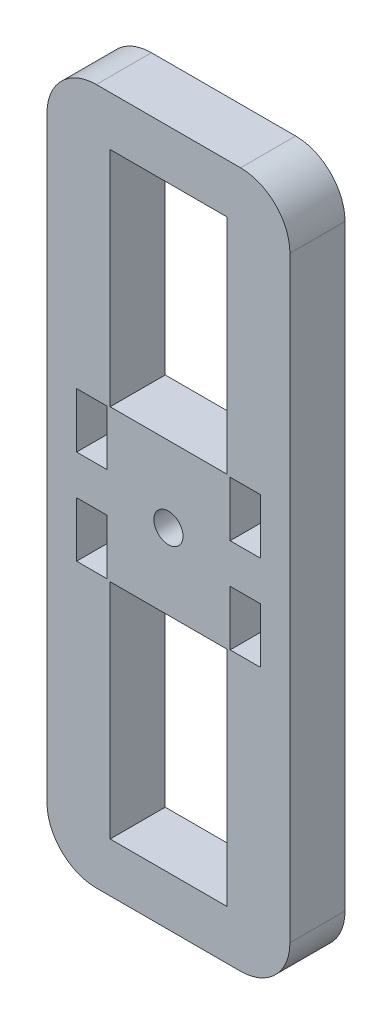
ISO-10303-21;
HEADER;
FILE_DESCRIPTION(('STEP AP214'),'2;1');
FILE_NAME('part.step','',(''),(''),'','','');
FILE_SCHEMA(('AUTOMOTIVE_DESIGN { 1 0 10303 214 1 1 1 1 }'));
ENDSEC;
DATA;
#1=APPLICATION_CONTEXT('core data for automotive mechanical design processes');
#2=APPLICATION_PROTOCOL_DEFINITION('international standard','automotive_design',2000,#1);
#3=PRODUCT_CONTEXT('',#1,'mechanical');
#4=PRODUCT('Part','Part','',(#3));
#5=PRODUCT_RELATED_PRODUCT_CATEGORY('part','',(#4));
#6=PRODUCT_DEFINITION_FORMATION('','',#4);
#7=PRODUCT_DEFINITION_CONTEXT('part definition',#1,'design');
#8=PRODUCT_DEFINITION('design','',#6,#7);
#9=PRODUCT_DEFINITION_SHAPE('','',#8);
#10=(LENGTH_UNIT() NAMED_UNIT(*) SI_UNIT(.MILLI.,.METRE.));
#11=(NAMED_UNIT(*) PLANE_ANGLE_UNIT() SI_UNIT($,.RADIAN.));
#12=(NAMED_UNIT(*) SI_UNIT($,.STERADIAN.) SOLID_ANGLE_UNIT());
#13=UNCERTAINTY_MEASURE_WITH_UNIT(LENGTH_MEASURE(1.E-05),#10,'distance_accuracy_value','');
#14=(GEOMETRIC_REPRESENTATION_CONTEXT(3) GLOBAL_UNCERTAINTY_ASSIGNED_CONTEXT((#13)) GLOBAL_UNIT_ASSIGNED_CONTEXT((#10,
#11,#12)) REPRESENTATION_CONTEXT('',''));
#15=CARTESIAN_POINT('',(0.,0.,0.));
#16=DIRECTION('',(0.,0.,1.));
#17=DIRECTION('',(1.,0.,0.));
#18=AXIS2_PLACEMENT_3D('',#15,#16,#17);
#19=CARTESIAN_POINT('',(0.,432.709671906504,5.58));
#20=DIRECTION('',(0.,1.,0.));
#21=DIRECTION('',(0.,0.,1.));
#22=AXIS2_PLACEMENT_3D('',#19,#20,#21);
#23=PLANE('',#22);
#24=DIRECTION('',(1.,0.,0.));
#25=VECTOR('',#24,1.);
#26=CARTESIAN_POINT('',(0.,432.709671906504,0.));
#27=LINE('',#26,#25);
#28=CARTESIAN_POINT('',(708.390729088938,432.709671906504,0.));
#29=VERTEX_POINT('',#28);
#30=CARTESIAN_POINT('',(723.000729088939,432.709671906504,0.));
#31=VERTEX_POINT('',#30);
#32=EDGE_CURVE('E355',#29,#31,#27,.T.);
#33=ORIENTED_EDGE('',*,*,#32,.T.);
#34=DIRECTION('',(0.,0.,-1.));
#35=VECTOR('',#34,1.);
#36=CARTESIAN_POINT('',(723.000729088939,432.709671906504,5.58));
#37=LINE('',#36,#35);
#38=CARTESIAN_POINT('',(723.000729088939,432.709671906504,5.58));
#39=VERTEX_POINT('',#38);
#40=EDGE_CURVE('E11',#39,#31,#37,.T.);
#41=ORIENTED_EDGE('',*,*,#40,.F.);
#42=DIRECTION('',(1.,0.,0.));
#43=VECTOR('',#42,1.);
#44=CARTESIAN_POINT('',(0.,432.709671906504,5.58));
#45=LINE('',#44,#43);
#46=CARTESIAN_POINT('',(708.390729088938,432.709671906504,5.58));
#47=VERTEX_POINT('',#46);
#48=EDGE_CURVE('E513',#47,#39,#45,.T.);
#49=ORIENTED_EDGE('',*,*,#48,.F.);
#50=DIRECTION('',(0.,0.,-1.));
#51=VECTOR('',#50,1.);
#52=CARTESIAN_POINT('',(708.390729088938,432.709671906504,5.58));
#53=LINE('',#52,#51);
#54=EDGE_CURVE('E56',#47,#29,#53,.T.);
#55=ORIENTED_EDGE('',*,*,#54,.T.);
#56=EDGE_LOOP('',(#33,#41,#49,#55));
#57=FACE_BOUND('',#56,.T.);
#58=ADVANCED_FACE('F37',(#57),#23,.F.);
#59=CARTESIAN_POINT('',(723.000729088939,437.709671906504,5.58));
#60=DIRECTION('',(0.,0.,-1.));
#61=DIRECTION('',(-1.,0.,0.));
#62=AXIS2_PLACEMENT_3D('',#59,#60,#61);
#63=CYLINDRICAL_SURFACE('',#62,4.99999999999989);
#64=CARTESIAN_POINT('',(723.000729088939,437.709671906504,0.));
#65=DIRECTION('',(0.,0.,1.));
#66=DIRECTION('',(1.,0.,0.));
#67=AXIS2_PLACEMENT_3D('',#64,#65,#66);
#68=CIRCLE('',#67,4.99999999999989);
#69=CARTESIAN_POINT('',(728.000729088939,437.709671906504,0.));
#70=VERTEX_POINT('',#69);
#71=EDGE_CURVE('E357',#31,#70,#68,.T.);
#72=ORIENTED_EDGE('',*,*,#71,.T.);
#73=DIRECTION('',(0.,0.,-1.));
#74=VECTOR('',#73,1.);
#75=CARTESIAN_POINT('',(728.000729088939,437.709671906504,5.58));
#76=LINE('',#75,#74);
#77=CARTESIAN_POINT('',(728.000729088939,437.709671906504,5.58));
#78=VERTEX_POINT('',#77);
#79=EDGE_CURVE('E47',#78,#70,#76,.T.);
#80=ORIENTED_EDGE('',*,*,#79,.F.);
#81=CARTESIAN_POINT('',(723.000729088939,437.709671906504,5.58));
#82=DIRECTION('',(0.,0.,1.));
#83=DIRECTION('',(1.,0.,0.));
#84=AXIS2_PLACEMENT_3D('',#81,#82,#83);
#85=CIRCLE('',#84,4.99999999999989);
#86=EDGE_CURVE('E515',#39,#78,#85,.T.);
#87=ORIENTED_EDGE('',*,*,#86,.F.);
#88=ORIENTED_EDGE('',*,*,#40,.T.);
#89=EDGE_LOOP('',(#72,#80,#87,#88));
#90=FACE_BOUND('',#89,.T.);
#91=ADVANCED_FACE('F540',(#90),#63,.T.);
#92=CARTESIAN_POINT('',(728.000729088939,0.,5.58));
#93=DIRECTION('',(1.,0.,0.));
#94=DIRECTION('',(0.,0.,-1.));
#95=AXIS2_PLACEMENT_3D('',#92,#93,#94);
#96=PLANE('',#95);
#97=DIRECTION('',(0.,-1.,0.));
#98=VECTOR('',#97,1.);
#99=CARTESIAN_POINT('',(728.000729088939,0.,0.));
#100=LINE('',#99,#98);
#101=CARTESIAN_POINT('',(728.000729088939,498.199671906504,0.));
#102=VERTEX_POINT('',#101);
#103=EDGE_CURVE('E360',#102,#70,#100,.T.);
#104=ORIENTED_EDGE('',*,*,#103,.F.);
#105=DIRECTION('',(0.,0.,-1.));
#106=VECTOR('',#105,1.);
#107=CARTESIAN_POINT('',(728.000729088939,498.199671906504,5.58));
#108=LINE('',#107,#106);
#109=CARTESIAN_POINT('',(728.000729088939,498.199671906504,5.58));
#110=VERTEX_POINT('',#109);
#111=EDGE_CURVE('E382',#110,#102,#108,.T.);
#112=ORIENTED_EDGE('',*,*,#111,.F.);
#113=DIRECTION('',(0.,-1.,0.));
#114=VECTOR('',#113,1.);
#115=CARTESIAN_POINT('',(728.000729088939,0.,5.58));
#116=LINE('',#115,#114);
#117=EDGE_CURVE('E517',#110,#78,#116,.T.);
#118=ORIENTED_EDGE('',*,*,#117,.T.);
#119=ORIENTED_EDGE('',*,*,#79,.T.);
#120=EDGE_LOOP('',(#104,#112,#118,#119));
#121=FACE_BOUND('',#120,.T.);
#122=ADVANCED_FACE('F545',(#121),#96,.T.);
#123=CARTESIAN_POINT('',(723.000729088939,498.199671906504,5.58));
#124=DIRECTION('',(0.,0.,-1.));
#125=DIRECTION('',(-1.,0.,0.));
#126=AXIS2_PLACEMENT_3D('',#123,#124,#125);
#127=CYLINDRICAL_SURFACE('',#126,4.99999999999995);
#128=CARTESIAN_POINT('',(723.000729088939,498.199671906504,0.));
#129=DIRECTION('',(0.,0.,1.));
#130=DIRECTION('',(1.,0.,0.));
#131=AXIS2_PLACEMENT_3D('',#128,#129,#130);
#132=CIRCLE('',#131,4.99999999999995);
#133=CARTESIAN_POINT('',(723.000729088939,503.199671906504,0.));
#134=VERTEX_POINT('',#133);
#135=EDGE_CURVE('E363',#134,#102,#132,.F.);
#136=ORIENTED_EDGE('',*,*,#135,.F.);
#137=DIRECTION('',(0.,0.,-1.));
#138=VECTOR('',#137,1.);
#139=CARTESIAN_POINT('',(723.000729088939,503.199671906504,5.58));
#140=LINE('',#139,#138);
#141=CARTESIAN_POINT('',(723.000729088939,503.199671906504,5.58));
#142=VERTEX_POINT('',#141);
#143=EDGE_CURVE('E380',#142,#134,#140,.T.);
#144=ORIENTED_EDGE('',*,*,#143,.F.);
#145=CARTESIAN_POINT('',(723.000729088939,498.199671906504,5.58));
#146=DIRECTION('',(0.,0.,1.));
#147=DIRECTION('',(1.,0.,0.));
#148=AXIS2_PLACEMENT_3D('',#145,#146,#147);
#149=CIRCLE('',#148,4.99999999999995);
#150=EDGE_CURVE('E520',#142,#110,#149,.F.);
#151=ORIENTED_EDGE('',*,*,#150,.T.);
#152=ORIENTED_EDGE('',*,*,#111,.T.);
#153=EDGE_LOOP('',(#136,#144,#151,#152));
#154=FACE_BOUND('',#153,.T.);
#155=ADVANCED_FACE('F717',(#154),#127,.T.);
#156=CARTESIAN_POINT('',(0.,503.199671906504,5.58));
#157=DIRECTION('',(0.,1.,0.));
#158=DIRECTION('',(0.,0.,1.));
#159=AXIS2_PLACEMENT_3D('',#156,#157,#158);
#160=PLANE('',#159);
#161=DIRECTION('',(1.,0.,0.));
#162=VECTOR('',#161,1.);
#163=CARTESIAN_POINT('',(0.,503.199671906504,0.));
#164=LINE('',#163,#162);
#165=CARTESIAN_POINT('',(708.390729088938,503.199671906504,0.));
#166=VERTEX_POINT('',#165);
#167=EDGE_CURVE('E366',#166,#134,#164,.T.);
#168=ORIENTED_EDGE('',*,*,#167,.F.);
#169=DIRECTION('',(0.,0.,-1.));
#170=VECTOR('',#169,1.);
#171=CARTESIAN_POINT('',(708.390729088938,503.199671906504,5.58));
#172=LINE('',#171,#170);
#173=CARTESIAN_POINT('',(708.390729088938,503.199671906504,5.58));
#174=VERTEX_POINT('',#173);
#175=EDGE_CURVE('E274',#174,#166,#172,.T.);
#176=ORIENTED_EDGE('',*,*,#175,.F.);
#177=DIRECTION('',(1.,0.,0.));
#178=VECTOR('',#177,1.);
#179=CARTESIAN_POINT('',(0.,503.199671906504,5.58));
#180=LINE('',#179,#178);
#181=EDGE_CURVE('E264',#174,#142,#180,.T.);
#182=ORIENTED_EDGE('',*,*,#181,.T.);
#183=ORIENTED_EDGE('',*,*,#143,.T.);
#184=EDGE_LOOP('',(#168,#176,#182,#183));
#185=FACE_BOUND('',#184,.T.);
#186=ADVANCED_FACE('F524',(#185),#160,.T.);
#187=CARTESIAN_POINT('',(708.390729088938,498.199671906504,5.58));
#188=DIRECTION('',(0.,0.,-1.));
#189=DIRECTION('',(-1.,0.,0.));
#190=AXIS2_PLACEMENT_3D('',#187,#188,#189);
#191=CYLINDRICAL_SURFACE('',#190,4.99999999999998);
#192=CARTESIAN_POINT('',(708.390729088938,498.199671906504,0.));
#193=DIRECTION('',(0.,0.,1.));
#194=DIRECTION('',(1.,0.,0.));
#195=AXIS2_PLACEMENT_3D('',#192,#193,#194);
#196=CIRCLE('',#195,4.99999999999998);
#197=CARTESIAN_POINT('',(703.390729088938,498.199671906504,0.));
#198=VERTEX_POINT('',#197);
#199=EDGE_CURVE('E271',#166,#198,#196,.T.);
#200=ORIENTED_EDGE('',*,*,#199,.T.);
#201=DIRECTION('',(0.,0.,-1.));
#202=VECTOR('',#201,1.);
#203=CARTESIAN_POINT('',(703.390729088938,498.199671906504,5.58));
#204=LINE('',#203,#202);
#205=CARTESIAN_POINT('',(703.390729088938,498.199671906504,5.58));
#206=VERTEX_POINT('',#205);
#207=EDGE_CURVE('E268',#206,#198,#204,.T.);
#208=ORIENTED_EDGE('',*,*,#207,.F.);
#209=CARTESIAN_POINT('',(708.390729088938,498.199671906504,5.58));
#210=DIRECTION('',(0.,0.,1.));
#211=DIRECTION('',(1.,0.,0.));
#212=AXIS2_PLACEMENT_3D('',#209,#210,#211);
#213=CIRCLE('',#212,4.99999999999998);
#214=EDGE_CURVE('E255',#174,#206,#213,.T.);
#215=ORIENTED_EDGE('',*,*,#214,.F.);
#216=ORIENTED_EDGE('',*,*,#175,.T.);
#217=EDGE_LOOP('',(#200,#208,#215,#216));
#218=FACE_BOUND('',#217,.T.);
#219=ADVANCED_FACE('F269',(#218),#191,.T.);
#220=CARTESIAN_POINT('',(703.390729088938,0.,5.58));
#221=DIRECTION('',(1.,0.,0.));
#222=DIRECTION('',(0.,0.,-1.));
#223=AXIS2_PLACEMENT_3D('',#220,#221,#222);
#224=PLANE('',#223);
#225=DIRECTION('',(0.,-1.,0.));
#226=VECTOR('',#225,1.);
#227=CARTESIAN_POINT('',(703.390729088938,0.,0.));
#228=LINE('',#227,#226);
#229=CARTESIAN_POINT('',(703.390729088938,437.709671906504,0.));
#230=VERTEX_POINT('',#229);
#231=EDGE_CURVE('E370',#198,#230,#228,.T.);
#232=ORIENTED_EDGE('',*,*,#231,.T.);
#233=DIRECTION('',(0.,0.,-1.));
#234=VECTOR('',#233,1.);
#235=CARTESIAN_POINT('',(703.390729088938,437.709671906504,5.58));
#236=LINE('',#235,#234);
#237=CARTESIAN_POINT('',(703.390729088938,437.709671906504,5.58));
#238=VERTEX_POINT('',#237);
#239=EDGE_CURVE('E155',#238,#230,#236,.T.);
#240=ORIENTED_EDGE('',*,*,#239,.F.);
#241=DIRECTION('',(0.,-1.,0.));
#242=VECTOR('',#241,1.);
#243=CARTESIAN_POINT('',(703.390729088938,0.,5.58));
#244=LINE('',#243,#242);
#245=EDGE_CURVE('E261',#206,#238,#244,.T.);
#246=ORIENTED_EDGE('',*,*,#245,.F.);
#247=ORIENTED_EDGE('',*,*,#207,.T.);
#248=EDGE_LOOP('',(#232,#240,#246,#247));
#249=FACE_BOUND('',#248,.T.);
#250=ADVANCED_FACE('F276',(#249),#224,.F.);
#251=CARTESIAN_POINT('',(0.,437.709671906504,5.58));
#252=DIRECTION('',(0.,1.,0.));
#253=DIRECTION('',(0.,0.,1.));
#254=AXIS2_PLACEMENT_3D('',#251,#252,#253);
#255=PLANE('',#254);
#256=DIRECTION('',(1.,0.,0.));
#257=VECTOR('',#256,1.);
#258=CARTESIAN_POINT('',(0.,437.709671906504,0.));
#259=LINE('',#258,#257);
#260=CARTESIAN_POINT('',(709.790729088939,437.709671906504,0.));
#261=VERTEX_POINT('',#260);
#262=CARTESIAN_POINT('',(721.600729088938,437.709671906504,0.));
#263=VERTEX_POINT('',#262);
#264=EDGE_CURVE('E340',#261,#263,#259,.T.);
#265=ORIENTED_EDGE('',*,*,#264,.F.);
#266=DIRECTION('',(0.,0.,-1.));
#267=VECTOR('',#266,1.);
#268=CARTESIAN_POINT('',(709.790729088939,437.709671906504,5.58));
#269=LINE('',#268,#267);
#270=CARTESIAN_POINT('',(709.790729088939,437.709671906504,5.58));
#271=VERTEX_POINT('',#270);
#272=EDGE_CURVE('E377',#271,#261,#269,.T.);
#273=ORIENTED_EDGE('',*,*,#272,.F.);
#274=DIRECTION('',(1.,0.,0.));
#275=VECTOR('',#274,1.);
#276=CARTESIAN_POINT('',(0.,437.709671906504,5.58));
#277=LINE('',#276,#275);
#278=CARTESIAN_POINT('',(721.600729088938,437.709671906504,5.58));
#279=VERTEX_POINT('',#278);
#280=EDGE_CURVE('E498',#271,#279,#277,.T.);
#281=ORIENTED_EDGE('',*,*,#280,.T.);
#282=DIRECTION('',(0.,0.,-1.));
#283=VECTOR('',#282,1.);
#284=CARTESIAN_POINT('',(721.600729088938,437.709671906504,5.58));
#285=LINE('',#284,#283);
#286=EDGE_CURVE('E385',#279,#263,#285,.T.);
#287=ORIENTED_EDGE('',*,*,#286,.T.);
#288=EDGE_LOOP('',(#265,#273,#281,#287));
#289=FACE_BOUND('',#288,.T.);
#290=ADVANCED_FACE('F567',(#289),#255,.T.);
#291=CARTESIAN_POINT('',(709.790729088936,-3.4914754545858E-12,5.58));
#292=DIRECTION('',(1.,0.,0.));
#293=DIRECTION('',(0.,1.,0.));
#294=AXIS2_PLACEMENT_3D('',#291,#292,#293);
#295=PLANE('',#294);
#296=DIRECTION('',(0.,-1.,0.));
#297=VECTOR('',#296,1.);
#298=CARTESIAN_POINT('',(709.790729088936,-3.4914754545858E-12,0.));
#299=LINE('',#298,#297);
#300=CARTESIAN_POINT('',(709.790729088939,460.279671906504,0.));
#301=VERTEX_POINT('',#300);
#302=EDGE_CURVE('E343',#301,#261,#299,.T.);
#303=ORIENTED_EDGE('',*,*,#302,.F.);
#304=DIRECTION('',(0.,0.,-1.));
#305=VECTOR('',#304,1.);
#306=CARTESIAN_POINT('',(709.790729088939,460.279671906504,5.58));
#307=LINE('',#306,#305);
#308=CARTESIAN_POINT('',(709.790729088939,460.279671906504,5.58));
#309=VERTEX_POINT('',#308);
#310=EDGE_CURVE('E390',#309,#301,#307,.T.);
#311=ORIENTED_EDGE('',*,*,#310,.F.);
#312=DIRECTION('',(0.,-1.,0.));
#313=VECTOR('',#312,1.);
#314=CARTESIAN_POINT('',(709.790729088936,-3.4914754545858E-12,5.58));
#315=LINE('',#314,#313);
#316=EDGE_CURVE('E501',#309,#271,#315,.T.);
#317=ORIENTED_EDGE('',*,*,#316,.T.);
#318=ORIENTED_EDGE('',*,*,#272,.T.);
#319=EDGE_LOOP('',(#303,#311,#317,#318));
#320=FACE_BOUND('',#319,.T.);
#321=ADVANCED_FACE('F563',(#320),#295,.T.);
#322=CARTESIAN_POINT('',(0.,460.279671906504,5.58));
#323=DIRECTION('',(0.,-1.,0.));
#324=DIRECTION('',(0.,0.,-1.));
#325=AXIS2_PLACEMENT_3D('',#322,#323,#324);
#326=PLANE('',#325);
#327=DIRECTION('',(-1.,0.,0.));
#328=VECTOR('',#327,1.);
#329=CARTESIAN_POINT('',(0.,460.279671906504,0.));
#330=LINE('',#329,#328);
#331=CARTESIAN_POINT('',(721.600729088938,460.279671906504,0.));
#332=VERTEX_POINT('',#331);
#333=EDGE_CURVE('E346',#332,#301,#330,.T.);
#334=ORIENTED_EDGE('',*,*,#333,.F.);
#335=DIRECTION('',(0.,0.,-1.));
#336=VECTOR('',#335,1.);
#337=CARTESIAN_POINT('',(721.600729088938,460.279671906504,5.58));
#338=LINE('',#337,#336);
#339=CARTESIAN_POINT('',(721.600729088938,460.279671906504,5.58));
#340=VERTEX_POINT('',#339);
#341=EDGE_CURVE('E387',#340,#332,#338,.T.);
#342=ORIENTED_EDGE('',*,*,#341,.F.);
#343=DIRECTION('',(-1.,0.,0.));
#344=VECTOR('',#343,1.);
#345=CARTESIAN_POINT('',(0.,460.279671906504,5.58));
#346=LINE('',#345,#344);
#347=EDGE_CURVE('E504',#340,#309,#346,.T.);
#348=ORIENTED_EDGE('',*,*,#347,.T.);
#349=ORIENTED_EDGE('',*,*,#310,.T.);
#350=EDGE_LOOP('',(#334,#342,#348,#349));
#351=FACE_BOUND('',#350,.T.);
#352=ADVANCED_FACE('F559',(#351),#326,.T.);
#353=CARTESIAN_POINT('',(709.445729088938,0.,5.58));
#354=DIRECTION('',(-1.,0.,0.));
#355=DIRECTION('',(0.,0.,1.));
#356=AXIS2_PLACEMENT_3D('',#353,#354,#355);
#357=PLANE('',#356);
#358=DIRECTION('',(0.,1.,0.));
#359=VECTOR('',#358,1.);
#360=CARTESIAN_POINT('',(709.445729088938,0.,0.));
#361=LINE('',#360,#359);
#362=CARTESIAN_POINT('',(709.445729088938,460.379671906504,0.));
#363=VERTEX_POINT('',#362);
#364=CARTESIAN_POINT('',(709.445729088938,465.954671906504,0.));
#365=VERTEX_POINT('',#364);
#366=EDGE_CURVE('E328',#363,#365,#361,.T.);
#367=ORIENTED_EDGE('',*,*,#366,.F.);
#368=DIRECTION('',(0.,0.,-1.));
#369=VECTOR('',#368,1.);
#370=CARTESIAN_POINT('',(709.445729088938,460.379671906504,5.58));
#371=LINE('',#370,#369);
#372=CARTESIAN_POINT('',(709.445729088938,460.379671906504,5.58));
#373=VERTEX_POINT('',#372);
#374=EDGE_CURVE('E388',#373,#363,#371,.T.);
#375=ORIENTED_EDGE('',*,*,#374,.F.);
#376=DIRECTION('',(0.,1.,0.));
#377=VECTOR('',#376,1.);
#378=CARTESIAN_POINT('',(709.445729088938,0.,5.58));
#379=LINE('',#378,#377);
#380=CARTESIAN_POINT('',(709.445729088938,465.954671906504,5.58));
#381=VERTEX_POINT('',#380);
#382=EDGE_CURVE('E488',#373,#381,#379,.T.);
#383=ORIENTED_EDGE('',*,*,#382,.T.);
#384=DIRECTION('',(0.,0.,-1.));
#385=VECTOR('',#384,1.);
#386=CARTESIAN_POINT('',(709.445729088938,465.954671906504,5.58));
#387=LINE('',#386,#385);
#388=EDGE_CURVE('E393',#381,#365,#387,.T.);
#389=ORIENTED_EDGE('',*,*,#388,.T.);
#390=EDGE_LOOP('',(#367,#375,#383,#389));
#391=FACE_BOUND('',#390,.T.);
#392=ADVANCED_FACE('F562',(#391),#357,.T.);
#393=CARTESIAN_POINT('',(-8.36537007888636E-12,460.379671906491,5.58));
#394=DIRECTION('',(0.,-1.,0.));
#395=DIRECTION('',(1.,0.,0.));
#396=AXIS2_PLACEMENT_3D('',#393,#394,#395);
#397=PLANE('',#396);
#398=DIRECTION('',(-1.,0.,0.));
#399=VECTOR('',#398,1.);
#400=CARTESIAN_POINT('',(-8.36537007888636E-12,460.379671906491,0.));
#401=LINE('',#400,#399);
#402=CARTESIAN_POINT('',(706.390729088939,460.379671906504,0.));
#403=VERTEX_POINT('',#402);
#404=EDGE_CURVE('E331',#363,#403,#401,.T.);
#405=ORIENTED_EDGE('',*,*,#404,.T.);
#406=DIRECTION('',(0.,0.,-1.));
#407=VECTOR('',#406,1.);
#408=CARTESIAN_POINT('',(706.390729088939,460.379671906504,5.58));
#409=LINE('',#408,#407);
#410=CARTESIAN_POINT('',(706.390729088939,460.379671906504,5.58));
#411=VERTEX_POINT('',#410);
#412=EDGE_CURVE('E398',#411,#403,#409,.T.);
#413=ORIENTED_EDGE('',*,*,#412,.F.);
#414=DIRECTION('',(-1.,0.,0.));
#415=VECTOR('',#414,1.);
#416=CARTESIAN_POINT('',(-8.36537007888636E-12,460.379671906491,5.58));
#417=LINE('',#416,#415);
#418=EDGE_CURVE('E491',#373,#411,#417,.T.);
#419=ORIENTED_EDGE('',*,*,#418,.F.);
#420=ORIENTED_EDGE('',*,*,#374,.T.);
#421=EDGE_LOOP('',(#405,#413,#419,#420));
#422=FACE_BOUND('',#421,.T.);
#423=ADVANCED_FACE('F580',(#422),#397,.F.);
#424=CARTESIAN_POINT('',(706.390729088939,0.,5.58));
#425=DIRECTION('',(1.,0.,0.));
#426=DIRECTION('',(0.,0.,-1.));
#427=AXIS2_PLACEMENT_3D('',#424,#425,#426);
#428=PLANE('',#427);
#429=DIRECTION('',(0.,-1.,0.));
#430=VECTOR('',#429,1.);
#431=CARTESIAN_POINT('',(706.390729088939,0.,0.));
#432=LINE('',#431,#430);
#433=CARTESIAN_POINT('',(706.390729088939,465.954671906504,0.));
#434=VERTEX_POINT('',#433);
#435=EDGE_CURVE('E334',#434,#403,#432,.T.);
#436=ORIENTED_EDGE('',*,*,#435,.F.);
#437=DIRECTION('',(0.,0.,-1.));
#438=VECTOR('',#437,1.);
#439=CARTESIAN_POINT('',(706.390729088939,465.954671906504,5.58));
#440=LINE('',#439,#438);
#441=CARTESIAN_POINT('',(706.390729088939,465.954671906504,5.58));
#442=VERTEX_POINT('',#441);
#443=EDGE_CURVE('E395',#442,#434,#440,.T.);
#444=ORIENTED_EDGE('',*,*,#443,.F.);
#445=DIRECTION('',(0.,-1.,0.));
#446=VECTOR('',#445,1.);
#447=CARTESIAN_POINT('',(706.390729088939,0.,5.58));
#448=LINE('',#447,#446);
#449=EDGE_CURVE('E493',#442,#411,#448,.T.);
#450=ORIENTED_EDGE('',*,*,#449,.T.);
#451=ORIENTED_EDGE('',*,*,#412,.T.);
#452=EDGE_LOOP('',(#436,#444,#450,#451));
#453=FACE_BOUND('',#452,.T.);
#454=ADVANCED_FACE('F576',(#453),#428,.T.);
#455=CARTESIAN_POINT('',(8.36537007888683E-12,460.379671906517,5.58));
#456=DIRECTION('',(0.,1.,0.));
#457=DIRECTION('',(-1.,0.,0.));
#458=AXIS2_PLACEMENT_3D('',#455,#456,#457);
#459=PLANE('',#458);
#460=DIRECTION('',(1.,0.,0.));
#461=VECTOR('',#460,1.);
#462=CARTESIAN_POINT('',(8.36537007888683E-12,460.379671906517,0.));
#463=LINE('',#462,#461);
#464=CARTESIAN_POINT('',(721.945729088938,460.379671906504,0.));
#465=VERTEX_POINT('',#464);
#466=CARTESIAN_POINT('',(725.000729088939,460.379671906504,0.));
#467=VERTEX_POINT('',#466);
#468=EDGE_CURVE('E316',#465,#467,#463,.T.);
#469=ORIENTED_EDGE('',*,*,#468,.F.);
#470=DIRECTION('',(0.,0.,-1.));
#471=VECTOR('',#470,1.);
#472=CARTESIAN_POINT('',(721.945729088938,460.379671906504,5.58));
#473=LINE('',#472,#471);
#474=CARTESIAN_POINT('',(721.945729088938,460.379671906504,5.58));
#475=VERTEX_POINT('',#474);
#476=EDGE_CURVE('E396',#475,#465,#473,.T.);
#477=ORIENTED_EDGE('',*,*,#476,.F.);
#478=DIRECTION('',(1.,0.,0.));
#479=VECTOR('',#478,1.);
#480=CARTESIAN_POINT('',(8.36537007888683E-12,460.379671906517,5.58));
#481=LINE('',#480,#479);
#482=CARTESIAN_POINT('',(725.000729088939,460.379671906504,5.58));
#483=VERTEX_POINT('',#482);
#484=EDGE_CURVE('E478',#475,#483,#481,.T.);
#485=ORIENTED_EDGE('',*,*,#484,.T.);
#486=DIRECTION('',(0.,0.,-1.));
#487=VECTOR('',#486,1.);
#488=CARTESIAN_POINT('',(725.000729088939,460.379671906504,5.58));
#489=LINE('',#488,#487);
#490=EDGE_CURVE('E401',#483,#467,#489,.T.);
#491=ORIENTED_EDGE('',*,*,#490,.T.);
#492=EDGE_LOOP('',(#469,#477,#485,#491));
#493=FACE_BOUND('',#492,.T.);
#494=ADVANCED_FACE('F579',(#493),#459,.T.);
#495=CARTESIAN_POINT('',(721.945729088938,0.,5.58));
#496=DIRECTION('',(-1.,0.,0.));
#497=DIRECTION('',(0.,0.,1.));
#498=AXIS2_PLACEMENT_3D('',#495,#496,#497);
#499=PLANE('',#498);
#500=DIRECTION('',(0.,1.,0.));
#501=VECTOR('',#500,1.);
#502=CARTESIAN_POINT('',(721.945729088938,0.,0.));
#503=LINE('',#502,#501);
#504=CARTESIAN_POINT('',(721.945729088938,465.954671906504,0.));
#505=VERTEX_POINT('',#504);
#506=EDGE_CURVE('E319',#465,#505,#503,.T.);
#507=ORIENTED_EDGE('',*,*,#506,.T.);
#508=DIRECTION('',(0.,0.,-1.));
#509=VECTOR('',#508,1.);
#510=CARTESIAN_POINT('',(721.945729088938,465.954671906504,5.58));
#511=LINE('',#510,#509);
#512=CARTESIAN_POINT('',(721.945729088938,465.954671906504,5.58));
#513=VERTEX_POINT('',#512);
#514=EDGE_CURVE('E406',#513,#505,#511,.T.);
#515=ORIENTED_EDGE('',*,*,#514,.F.);
#516=DIRECTION('',(0.,1.,0.));
#517=VECTOR('',#516,1.);
#518=CARTESIAN_POINT('',(721.945729088938,0.,5.58));
#519=LINE('',#518,#517);
#520=EDGE_CURVE('E481',#475,#513,#519,.T.);
#521=ORIENTED_EDGE('',*,*,#520,.F.);
#522=ORIENTED_EDGE('',*,*,#476,.T.);
#523=EDGE_LOOP('',(#507,#515,#521,#522));
#524=FACE_BOUND('',#523,.T.);
#525=ADVANCED_FACE('F596',(#524),#499,.F.);
#526=CARTESIAN_POINT('',(0.,465.954671906504,5.58));
#527=DIRECTION('',(0.,-1.,0.));
#528=DIRECTION('',(0.,0.,-1.));
#529=AXIS2_PLACEMENT_3D('',#526,#527,#528);
#530=PLANE('',#529);
#531=DIRECTION('',(-1.,0.,0.));
#532=VECTOR('',#531,1.);
#533=CARTESIAN_POINT('',(0.,465.954671906504,0.));
#534=LINE('',#533,#532);
#535=CARTESIAN_POINT('',(725.000729088939,465.954671906504,0.));
#536=VERTEX_POINT('',#535);
#537=EDGE_CURVE('E322',#536,#505,#534,.T.);
#538=ORIENTED_EDGE('',*,*,#537,.F.);
#539=DIRECTION('',(0.,0.,-1.));
#540=VECTOR('',#539,1.);
#541=CARTESIAN_POINT('',(725.000729088939,465.954671906504,5.58));
#542=LINE('',#541,#540);
#543=CARTESIAN_POINT('',(725.000729088939,465.954671906504,5.58));
#544=VERTEX_POINT('',#543);
#545=EDGE_CURVE('E403',#544,#536,#542,.T.);
#546=ORIENTED_EDGE('',*,*,#545,.F.);
#547=DIRECTION('',(-1.,0.,0.));
#548=VECTOR('',#547,1.);
#549=CARTESIAN_POINT('',(0.,465.954671906504,5.58));
#550=LINE('',#549,#548);
#551=EDGE_CURVE('E483',#544,#513,#550,.T.);
#552=ORIENTED_EDGE('',*,*,#551,.T.);
#553=ORIENTED_EDGE('',*,*,#514,.T.);
#554=EDGE_LOOP('',(#538,#546,#552,#553));
#555=FACE_BOUND('',#554,.T.);
#556=ADVANCED_FACE('F592',(#555),#530,.T.);
#557=CARTESIAN_POINT('',(0.,475.629671906504,5.58));
#558=DIRECTION('',(0.,-1.,0.));
#559=DIRECTION('',(0.,0.,-1.));
#560=AXIS2_PLACEMENT_3D('',#557,#558,#559);
#561=PLANE('',#560);
#562=DIRECTION('',(-1.,0.,0.));
#563=VECTOR('',#562,1.);
#564=CARTESIAN_POINT('',(0.,475.629671906504,0.));
#565=LINE('',#564,#563);
#566=CARTESIAN_POINT('',(721.600729088938,475.629671906504,0.));
#567=VERTEX_POINT('',#566);
#568=CARTESIAN_POINT('',(709.790729088939,475.629671906504,0.));
#569=VERTEX_POINT('',#568);
#570=EDGE_CURVE('E307',#567,#569,#565,.T.);
#571=ORIENTED_EDGE('',*,*,#570,.T.);
#572=DIRECTION('',(0.,0.,-1.));
#573=VECTOR('',#572,1.);
#574=CARTESIAN_POINT('',(709.790729088939,475.629671906504,5.58));
#575=LINE('',#574,#573);
#576=CARTESIAN_POINT('',(709.790729088939,475.629671906504,5.58));
#577=VERTEX_POINT('',#576);
#578=EDGE_CURVE('E404',#577,#569,#575,.T.);
#579=ORIENTED_EDGE('',*,*,#578,.F.);
#580=DIRECTION('',(-1.,0.,0.));
#581=VECTOR('',#580,1.);
#582=CARTESIAN_POINT('',(0.,475.629671906504,5.58));
#583=LINE('',#582,#581);
#584=CARTESIAN_POINT('',(721.600729088938,475.629671906504,5.58));
#585=VERTEX_POINT('',#584);
#586=EDGE_CURVE('E469',#585,#577,#583,.T.);
#587=ORIENTED_EDGE('',*,*,#586,.F.);
#588=DIRECTION('',(0.,0.,-1.));
#589=VECTOR('',#588,1.);
#590=CARTESIAN_POINT('',(721.600729088938,475.629671906504,5.58));
#591=LINE('',#590,#589);
#592=EDGE_CURVE('E409',#585,#567,#591,.T.);
#593=ORIENTED_EDGE('',*,*,#592,.T.);
#594=EDGE_LOOP('',(#571,#579,#587,#593));
#595=FACE_BOUND('',#594,.T.);
#596=ADVANCED_FACE('F595',(#595),#561,.F.);
#597=CARTESIAN_POINT('',(709.790729088939,0.,5.58));
#598=DIRECTION('',(-1.,0.,0.));
#599=DIRECTION('',(0.,0.,1.));
#600=AXIS2_PLACEMENT_3D('',#597,#598,#599);
#601=PLANE('',#600);
#602=DIRECTION('',(0.,1.,0.));
#603=VECTOR('',#602,1.);
#604=CARTESIAN_POINT('',(709.790729088939,0.,0.));
#605=LINE('',#604,#603);
#606=CARTESIAN_POINT('',(709.790729088939,498.199671906504,0.));
#607=VERTEX_POINT('',#606);
#608=EDGE_CURVE('E310',#569,#607,#605,.T.);
#609=ORIENTED_EDGE('',*,*,#608,.T.);
#610=DIRECTION('',(0.,0.,-1.));
#611=VECTOR('',#610,1.);
#612=CARTESIAN_POINT('',(709.790729088939,498.199671906504,5.58));
#613=LINE('',#612,#611);
#614=CARTESIAN_POINT('',(709.790729088939,498.199671906504,5.58));
#615=VERTEX_POINT('',#614);
#616=EDGE_CURVE('E416',#615,#607,#613,.T.);
#617=ORIENTED_EDGE('',*,*,#616,.F.);
#618=DIRECTION('',(0.,1.,0.));
#619=VECTOR('',#618,1.);
#620=CARTESIAN_POINT('',(709.790729088939,0.,5.58));
#621=LINE('',#620,#619);
#622=EDGE_CURVE('E472',#577,#615,#621,.T.);
#623=ORIENTED_EDGE('',*,*,#622,.F.);
#624=ORIENTED_EDGE('',*,*,#578,.T.);
#625=EDGE_LOOP('',(#609,#617,#623,#624));
#626=FACE_BOUND('',#625,.T.);
#627=ADVANCED_FACE('F611',(#626),#601,.F.);
#628=CARTESIAN_POINT('',(0.,498.199671906504,5.58));
#629=DIRECTION('',(0.,1.,0.));
#630=DIRECTION('',(0.,0.,1.));
#631=AXIS2_PLACEMENT_3D('',#628,#629,#630);
#632=PLANE('',#631);
#633=DIRECTION('',(1.,0.,0.));
#634=VECTOR('',#633,1.);
#635=CARTESIAN_POINT('',(0.,498.199671906504,0.));
#636=LINE('',#635,#634);
#637=CARTESIAN_POINT('',(721.600729088938,498.199671906504,0.));
#638=VERTEX_POINT('',#637);
#639=EDGE_CURVE('E312',#607,#638,#636,.T.);
#640=ORIENTED_EDGE('',*,*,#639,.T.);
#641=DIRECTION('',(0.,0.,-1.));
#642=VECTOR('',#641,1.);
#643=CARTESIAN_POINT('',(721.600729088938,498.199671906504,5.58));
#644=LINE('',#643,#642);
#645=CARTESIAN_POINT('',(721.600729088938,498.199671906504,5.58));
#646=VERTEX_POINT('',#645);
#647=EDGE_CURVE('E412',#646,#638,#644,.T.);
#648=ORIENTED_EDGE('',*,*,#647,.F.);
#649=DIRECTION('',(1.,0.,0.));
#650=VECTOR('',#649,1.);
#651=CARTESIAN_POINT('',(0.,498.199671906504,5.58));
#652=LINE('',#651,#650);
#653=EDGE_CURVE('E474',#615,#646,#652,.T.);
#654=ORIENTED_EDGE('',*,*,#653,.F.);
#655=ORIENTED_EDGE('',*,*,#616,.T.);
#656=EDGE_LOOP('',(#640,#648,#654,#655));
#657=FACE_BOUND('',#656,.T.);
#658=ADVANCED_FACE('F607',(#657),#632,.F.);
#659=CARTESIAN_POINT('',(0.,469.954671906504,5.58));
#660=DIRECTION('',(0.,1.,0.));
#661=DIRECTION('',(0.,0.,1.));
#662=AXIS2_PLACEMENT_3D('',#659,#660,#661);
#663=PLANE('',#662);
#664=DIRECTION('',(1.,0.,0.));
#665=VECTOR('',#664,1.);
#666=CARTESIAN_POINT('',(0.,469.954671906504,0.));
#667=LINE('',#666,#665);
#668=CARTESIAN_POINT('',(706.390729088939,469.954671906504,0.));
#669=VERTEX_POINT('',#668);
#670=CARTESIAN_POINT('',(709.445729088938,469.954671906504,0.));
#671=VERTEX_POINT('',#670);
#672=EDGE_CURVE('E295',#669,#671,#667,.T.);
#673=ORIENTED_EDGE('',*,*,#672,.F.);
#674=DIRECTION('',(0.,0.,-1.));
#675=VECTOR('',#674,1.);
#676=CARTESIAN_POINT('',(706.390729088939,469.954671906504,5.58));
#677=LINE('',#676,#675);
#678=CARTESIAN_POINT('',(706.390729088939,469.954671906504,5.58));
#679=VERTEX_POINT('',#678);
#680=EDGE_CURVE('E413',#679,#669,#677,.T.);
#681=ORIENTED_EDGE('',*,*,#680,.F.);
#682=DIRECTION('',(1.,0.,0.));
#683=VECTOR('',#682,1.);
#684=CARTESIAN_POINT('',(0.,469.954671906504,5.58));
#685=LINE('',#684,#683);
#686=CARTESIAN_POINT('',(709.445729088938,469.954671906504,5.58));
#687=VERTEX_POINT('',#686);
#688=EDGE_CURVE('E453',#679,#687,#685,.T.);
#689=ORIENTED_EDGE('',*,*,#688,.T.);
#690=DIRECTION('',(0.,0.,-1.));
#691=VECTOR('',#690,1.);
#692=CARTESIAN_POINT('',(709.445729088938,469.954671906504,5.58));
#693=LINE('',#692,#691);
#694=EDGE_CURVE('E421',#687,#671,#693,.T.);
#695=ORIENTED_EDGE('',*,*,#694,.T.);
#696=EDGE_LOOP('',(#673,#681,#689,#695));
#697=FACE_BOUND('',#696,.T.);
#698=ADVANCED_FACE('F610',(#697),#663,.T.);
#699=CARTESIAN_POINT('',(706.390729088939,0.,5.58));
#700=DIRECTION('',(-1.,0.,0.));
#701=DIRECTION('',(0.,0.,1.));
#702=AXIS2_PLACEMENT_3D('',#699,#700,#701);
#703=PLANE('',#702);
#704=DIRECTION('',(0.,1.,0.));
#705=VECTOR('',#704,1.);
#706=CARTESIAN_POINT('',(706.390729088939,0.,0.));
#707=LINE('',#706,#705);
#708=CARTESIAN_POINT('',(706.390729088939,475.529671906504,0.));
#709=VERTEX_POINT('',#708);
#710=EDGE_CURVE('E298',#669,#709,#707,.T.);
#711=ORIENTED_EDGE('',*,*,#710,.T.);
#712=DIRECTION('',(0.,0.,-1.));
#713=VECTOR('',#712,1.);
#714=CARTESIAN_POINT('',(706.390729088939,475.529671906504,5.58));
#715=LINE('',#714,#713);
#716=CARTESIAN_POINT('',(706.390729088939,475.529671906504,5.58));
#717=VERTEX_POINT('',#716);
#718=EDGE_CURVE('E425',#717,#709,#715,.T.);
#719=ORIENTED_EDGE('',*,*,#718,.F.);
#720=DIRECTION('',(0.,1.,0.));
#721=VECTOR('',#720,1.);
#722=CARTESIAN_POINT('',(706.390729088939,0.,5.58));
#723=LINE('',#722,#721);
#724=EDGE_CURVE('E462',#679,#717,#723,.T.);
#725=ORIENTED_EDGE('',*,*,#724,.F.);
#726=ORIENTED_EDGE('',*,*,#680,.T.);
#727=EDGE_LOOP('',(#711,#719,#725,#726));
#728=FACE_BOUND('',#727,.T.);
#729=ADVANCED_FACE('F625',(#728),#703,.F.);
#730=CARTESIAN_POINT('',(8.64065451134298E-12,475.529671906517,5.58));
#731=DIRECTION('',(0.,-1.,0.));
#732=DIRECTION('',(1.,0.,0.));
#733=AXIS2_PLACEMENT_3D('',#730,#731,#732);
#734=PLANE('',#733);
#735=DIRECTION('',(-1.,0.,0.));
#736=VECTOR('',#735,1.);
#737=CARTESIAN_POINT('',(8.64065451134298E-12,475.529671906517,0.));
#738=LINE('',#737,#736);
#739=CARTESIAN_POINT('',(709.445729088938,475.529671906504,0.));
#740=VERTEX_POINT('',#739);
#741=EDGE_CURVE('E301',#740,#709,#738,.T.);
#742=ORIENTED_EDGE('',*,*,#741,.F.);
#743=DIRECTION('',(0.,0.,-1.));
#744=VECTOR('',#743,1.);
#745=CARTESIAN_POINT('',(709.445729088938,475.529671906504,5.58));
#746=LINE('',#745,#744);
#747=CARTESIAN_POINT('',(709.445729088938,475.529671906504,5.58));
#748=VERTEX_POINT('',#747);
#749=EDGE_CURVE('E423',#748,#740,#746,.T.);
#750=ORIENTED_EDGE('',*,*,#749,.F.);
#751=DIRECTION('',(-1.,0.,0.));
#752=VECTOR('',#751,1.);
#753=CARTESIAN_POINT('',(8.64065451134298E-12,475.529671906517,5.58));
#754=LINE('',#753,#752);
#755=EDGE_CURVE('E464',#748,#717,#754,.T.);
#756=ORIENTED_EDGE('',*,*,#755,.T.);
#757=ORIENTED_EDGE('',*,*,#718,.T.);
#758=EDGE_LOOP('',(#742,#750,#756,#757));
#759=FACE_BOUND('',#758,.T.);
#760=ADVANCED_FACE('F622',(#759),#734,.T.);
#761=CARTESIAN_POINT('',(725.000729088939,0.,5.58));
#762=DIRECTION('',(-1.,0.,0.));
#763=DIRECTION('',(0.,0.,1.));
#764=AXIS2_PLACEMENT_3D('',#761,#762,#763);
#765=PLANE('',#764);
#766=DIRECTION('',(0.,1.,0.));
#767=VECTOR('',#766,1.);
#768=CARTESIAN_POINT('',(725.000729088939,0.,0.));
#769=LINE('',#768,#767);
#770=CARTESIAN_POINT('',(725.000729088939,469.954671906504,0.));
#771=VERTEX_POINT('',#770);
#772=CARTESIAN_POINT('',(725.000729088939,475.529671906504,0.));
#773=VERTEX_POINT('',#772);
#774=EDGE_CURVE('E283',#771,#773,#769,.T.);
#775=ORIENTED_EDGE('',*,*,#774,.F.);
#776=DIRECTION('',(0.,0.,-1.));
#777=VECTOR('',#776,1.);
#778=CARTESIAN_POINT('',(725.000729088939,469.954671906504,5.58));
#779=LINE('',#778,#777);
#780=CARTESIAN_POINT('',(725.000729088939,469.954671906504,5.58));
#781=VERTEX_POINT('',#780);
#782=EDGE_CURVE('E41',#781,#771,#779,.T.);
#783=ORIENTED_EDGE('',*,*,#782,.F.);
#784=DIRECTION('',(0.,1.,0.));
#785=VECTOR('',#784,1.);
#786=CARTESIAN_POINT('',(725.000729088939,0.,5.58));
#787=LINE('',#786,#785);
#788=CARTESIAN_POINT('',(725.000729088939,475.529671906504,5.58));
#789=VERTEX_POINT('',#788);
#790=EDGE_CURVE('E375',#781,#789,#787,.T.);
#791=ORIENTED_EDGE('',*,*,#790,.T.);
#792=DIRECTION('',(0.,0.,-1.));
#793=VECTOR('',#792,1.);
#794=CARTESIAN_POINT('',(725.000729088939,475.529671906504,5.58));
#795=LINE('',#794,#793);
#796=EDGE_CURVE('E279',#789,#773,#795,.T.);
#797=ORIENTED_EDGE('',*,*,#796,.T.);
#798=EDGE_LOOP('',(#775,#783,#791,#797));
#799=FACE_BOUND('',#798,.T.);
#800=ADVANCED_FACE('F39',(#799),#765,.T.);
#801=CARTESIAN_POINT('',(0.,469.954671906504,5.58));
#802=DIRECTION('',(0.,-1.,0.));
#803=DIRECTION('',(0.,0.,-1.));
#804=AXIS2_PLACEMENT_3D('',#801,#802,#803);
#805=PLANE('',#804);
#806=DIRECTION('',(-1.,0.,0.));
#807=VECTOR('',#806,1.);
#808=CARTESIAN_POINT('',(0.,469.954671906504,0.));
#809=LINE('',#808,#807);
#810=CARTESIAN_POINT('',(721.945729088938,469.954671906504,0.));
#811=VERTEX_POINT('',#810);
#812=EDGE_CURVE('E286',#771,#811,#809,.T.);
#813=ORIENTED_EDGE('',*,*,#812,.T.);
#814=DIRECTION('',(0.,0.,-1.));
#815=VECTOR('',#814,1.);
#816=CARTESIAN_POINT('',(721.945729088938,469.954671906504,5.58));
#817=LINE('',#816,#815);
#818=CARTESIAN_POINT('',(721.945729088938,469.954671906504,5.58));
#819=VERTEX_POINT('',#818);
#820=EDGE_CURVE('E430',#819,#811,#817,.T.);
#821=ORIENTED_EDGE('',*,*,#820,.F.);
#822=DIRECTION('',(-1.,0.,0.));
#823=VECTOR('',#822,1.);
#824=CARTESIAN_POINT('',(0.,469.954671906504,5.58));
#825=LINE('',#824,#823);
#826=EDGE_CURVE('E438',#781,#819,#825,.T.);
#827=ORIENTED_EDGE('',*,*,#826,.F.);
#828=ORIENTED_EDGE('',*,*,#782,.T.);
#829=EDGE_LOOP('',(#813,#821,#827,#828));
#830=FACE_BOUND('',#829,.T.);
#831=ADVANCED_FACE('F437',(#830),#805,.F.);
#832=CARTESIAN_POINT('',(721.945729088938,0.,5.58));
#833=DIRECTION('',(1.,0.,0.));
#834=DIRECTION('',(0.,0.,-1.));
#835=AXIS2_PLACEMENT_3D('',#832,#833,#834);
#836=PLANE('',#835);
#837=DIRECTION('',(0.,-1.,0.));
#838=VECTOR('',#837,1.);
#839=CARTESIAN_POINT('',(721.945729088938,0.,0.));
#840=LINE('',#839,#838);
#841=CARTESIAN_POINT('',(721.945729088938,475.529671906504,0.));
#842=VERTEX_POINT('',#841);
#843=EDGE_CURVE('E289',#842,#811,#840,.T.);
#844=ORIENTED_EDGE('',*,*,#843,.F.);
#845=DIRECTION('',(0.,0.,-1.));
#846=VECTOR('',#845,1.);
#847=CARTESIAN_POINT('',(721.945729088938,475.529671906504,5.58));
#848=LINE('',#847,#846);
#849=CARTESIAN_POINT('',(721.945729088938,475.529671906504,5.58));
#850=VERTEX_POINT('',#849);
#851=EDGE_CURVE('E429',#850,#842,#848,.T.);
#852=ORIENTED_EDGE('',*,*,#851,.F.);
#853=DIRECTION('',(0.,-1.,0.));
#854=VECTOR('',#853,1.);
#855=CARTESIAN_POINT('',(721.945729088938,0.,5.58));
#856=LINE('',#855,#854);
#857=EDGE_CURVE('E450',#850,#819,#856,.T.);
#858=ORIENTED_EDGE('',*,*,#857,.T.);
#859=ORIENTED_EDGE('',*,*,#820,.T.);
#860=EDGE_LOOP('',(#844,#852,#858,#859));
#861=FACE_BOUND('',#860,.T.);
#862=ADVANCED_FACE('F448',(#861),#836,.T.);
#863=CARTESIAN_POINT('',(715.695729088938,467.954671906504,5.58));
#864=DIRECTION('',(0.,0.,-1.));
#865=DIRECTION('',(-1.,0.,0.));
#866=AXIS2_PLACEMENT_3D('',#863,#864,#865);
#867=CYLINDRICAL_SURFACE('',#866,1.47500000000012);
#868=CARTESIAN_POINT('',(715.695729088938,467.954671906504,5.58));
#869=DIRECTION('',(0.,0.,1.));
#870=DIRECTION('',(1.,0.,0.));
#871=AXIS2_PLACEMENT_3D('',#868,#869,#870);
#872=CIRCLE('',#871,1.47500000000012);
#873=CARTESIAN_POINT('',(717.170729088939,467.954671906504,5.58));
#874=VERTEX_POINT('',#873);
#875=EDGE_CURVE('E510',#874,#874,#872,.T.);
#876=ORIENTED_EDGE('',*,*,#875,.T.);
#877=EDGE_LOOP('',(#876));
#878=FACE_BOUND('',#877,.T.);
#879=CARTESIAN_POINT('',(715.695729088938,467.954671906504,0.));
#880=DIRECTION('',(0.,0.,1.));
#881=DIRECTION('',(1.,0.,0.));
#882=AXIS2_PLACEMENT_3D('',#879,#880,#881);
#883=CIRCLE('',#882,1.47500000000012);
#884=CARTESIAN_POINT('',(717.170729088939,467.954671906504,0.));
#885=VERTEX_POINT('',#884);
#886=EDGE_CURVE('E352',#885,#885,#883,.T.);
#887=ORIENTED_EDGE('',*,*,#886,.F.);
#888=EDGE_LOOP('',(#887));
#889=FACE_BOUND('',#888,.T.);
#890=ADVANCED_FACE('F550',(#878,#889),#867,.F.);
#891=CARTESIAN_POINT('',(721.600729088938,0.,5.58));
#892=DIRECTION('',(-1.,0.,0.));
#893=DIRECTION('',(0.,0.,1.));
#894=AXIS2_PLACEMENT_3D('',#891,#892,#893);
#895=PLANE('',#894);
#896=DIRECTION('',(0.,1.,0.));
#897=VECTOR('',#896,1.);
#898=CARTESIAN_POINT('',(721.600729088938,0.,0.));
#899=LINE('',#898,#897);
#900=EDGE_CURVE('E349',#263,#332,#899,.T.);
#901=ORIENTED_EDGE('',*,*,#900,.F.);
#902=ORIENTED_EDGE('',*,*,#286,.F.);
#903=DIRECTION('',(0.,1.,0.));
#904=VECTOR('',#903,1.);
#905=CARTESIAN_POINT('',(721.600729088938,0.,5.58));
#906=LINE('',#905,#904);
#907=EDGE_CURVE('E507',#279,#340,#906,.T.);
#908=ORIENTED_EDGE('',*,*,#907,.T.);
#909=ORIENTED_EDGE('',*,*,#341,.T.);
#910=EDGE_LOOP('',(#901,#902,#908,#909));
#911=FACE_BOUND('',#910,.T.);
#912=ADVANCED_FACE('F553',(#911),#895,.T.);
#913=CARTESIAN_POINT('',(0.,465.954671906504,5.58));
#914=DIRECTION('',(0.,1.,0.));
#915=DIRECTION('',(0.,0.,1.));
#916=AXIS2_PLACEMENT_3D('',#913,#914,#915);
#917=PLANE('',#916);
#918=DIRECTION('',(1.,0.,0.));
#919=VECTOR('',#918,1.);
#920=CARTESIAN_POINT('',(0.,465.954671906504,0.));
#921=LINE('',#920,#919);
#922=EDGE_CURVE('E337',#434,#365,#921,.T.);
#923=ORIENTED_EDGE('',*,*,#922,.T.);
#924=ORIENTED_EDGE('',*,*,#388,.F.);
#925=DIRECTION('',(1.,0.,0.));
#926=VECTOR('',#925,1.);
#927=CARTESIAN_POINT('',(0.,465.954671906504,5.58));
#928=LINE('',#927,#926);
#929=EDGE_CURVE('E496',#442,#381,#928,.T.);
#930=ORIENTED_EDGE('',*,*,#929,.F.);
#931=ORIENTED_EDGE('',*,*,#443,.T.);
#932=EDGE_LOOP('',(#923,#924,#930,#931));
#933=FACE_BOUND('',#932,.T.);
#934=ADVANCED_FACE('F557',(#933),#917,.F.);
#935=CARTESIAN_POINT('',(725.000729088939,0.,5.58));
#936=DIRECTION('',(1.,0.,0.));
#937=DIRECTION('',(0.,0.,-1.));
#938=AXIS2_PLACEMENT_3D('',#935,#936,#937);
#939=PLANE('',#938);
#940=DIRECTION('',(0.,-1.,0.));
#941=VECTOR('',#940,1.);
#942=CARTESIAN_POINT('',(725.000729088939,0.,0.));
#943=LINE('',#942,#941);
#944=EDGE_CURVE('E325',#536,#467,#943,.T.);
#945=ORIENTED_EDGE('',*,*,#944,.T.);
#946=ORIENTED_EDGE('',*,*,#490,.F.);
#947=DIRECTION('',(0.,-1.,0.));
#948=VECTOR('',#947,1.);
#949=CARTESIAN_POINT('',(725.000729088939,0.,5.58));
#950=LINE('',#949,#948);
#951=EDGE_CURVE('E486',#544,#483,#950,.T.);
#952=ORIENTED_EDGE('',*,*,#951,.F.);
#953=ORIENTED_EDGE('',*,*,#545,.T.);
#954=EDGE_LOOP('',(#945,#946,#952,#953));
#955=FACE_BOUND('',#954,.T.);
#956=ADVANCED_FACE('F574',(#955),#939,.F.);
#957=CARTESIAN_POINT('',(721.600729088938,0.,5.58));
#958=DIRECTION('',(1.,0.,0.));
#959=DIRECTION('',(0.,0.,-1.));
#960=AXIS2_PLACEMENT_3D('',#957,#958,#959);
#961=PLANE('',#960);
#962=DIRECTION('',(0.,-1.,0.));
#963=VECTOR('',#962,1.);
#964=CARTESIAN_POINT('',(721.600729088938,0.,0.));
#965=LINE('',#964,#963);
#966=EDGE_CURVE('E314',#638,#567,#965,.T.);
#967=ORIENTED_EDGE('',*,*,#966,.T.);
#968=ORIENTED_EDGE('',*,*,#592,.F.);
#969=DIRECTION('',(0.,-1.,0.));
#970=VECTOR('',#969,1.);
#971=CARTESIAN_POINT('',(721.600729088938,0.,5.58));
#972=LINE('',#971,#970);
#973=EDGE_CURVE('E476',#646,#585,#972,.T.);
#974=ORIENTED_EDGE('',*,*,#973,.F.);
#975=ORIENTED_EDGE('',*,*,#647,.T.);
#976=EDGE_LOOP('',(#967,#968,#974,#975));
#977=FACE_BOUND('',#976,.T.);
#978=ADVANCED_FACE('F590',(#977),#961,.F.);
#979=CARTESIAN_POINT('',(709.445729088938,0.,5.58));
#980=DIRECTION('',(1.,0.,0.));
#981=DIRECTION('',(0.,0.,-1.));
#982=AXIS2_PLACEMENT_3D('',#979,#980,#981);
#983=PLANE('',#982);
#984=DIRECTION('',(0.,-1.,0.));
#985=VECTOR('',#984,1.);
#986=CARTESIAN_POINT('',(709.445729088938,0.,0.));
#987=LINE('',#986,#985);
#988=EDGE_CURVE('E304',#740,#671,#987,.T.);
#989=ORIENTED_EDGE('',*,*,#988,.T.);
#990=ORIENTED_EDGE('',*,*,#694,.F.);
#991=DIRECTION('',(0.,-1.,0.));
#992=VECTOR('',#991,1.);
#993=CARTESIAN_POINT('',(709.445729088938,0.,5.58));
#994=LINE('',#993,#992);
#995=EDGE_CURVE('E467',#748,#687,#994,.T.);
#996=ORIENTED_EDGE('',*,*,#995,.F.);
#997=ORIENTED_EDGE('',*,*,#749,.T.);
#998=EDGE_LOOP('',(#989,#990,#996,#997));
#999=FACE_BOUND('',#998,.T.);
#1000=ADVANCED_FACE('F535',(#999),#983,.F.);
#1001=CARTESIAN_POINT('',(-8.64065451134251E-12,475.529671906491,5.58));
#1002=DIRECTION('',(0.,1.,0.));
#1003=DIRECTION('',(-1.,0.,0.));
#1004=AXIS2_PLACEMENT_3D('',#1001,#1002,#1003);
#1005=PLANE('',#1004);
#1006=DIRECTION('',(1.,0.,0.));
#1007=VECTOR('',#1006,1.);
#1008=CARTESIAN_POINT('',(-8.64065451134251E-12,475.529671906491,0.));
#1009=LINE('',#1008,#1007);
#1010=EDGE_CURVE('E292',#842,#773,#1009,.T.);
#1011=ORIENTED_EDGE('',*,*,#1010,.T.);
#1012=ORIENTED_EDGE('',*,*,#796,.F.);
#1013=DIRECTION('',(1.,0.,0.));
#1014=VECTOR('',#1013,1.);
#1015=CARTESIAN_POINT('',(-8.64065451134251E-12,475.529671906491,5.58));
#1016=LINE('',#1015,#1014);
#1017=EDGE_CURVE('E451',#850,#789,#1016,.T.);
#1018=ORIENTED_EDGE('',*,*,#1017,.F.);
#1019=ORIENTED_EDGE('',*,*,#851,.T.);
#1020=EDGE_LOOP('',(#1011,#1012,#1018,#1019));
#1021=FACE_BOUND('',#1020,.T.);
#1022=ADVANCED_FACE('F447',(#1021),#1005,.F.);
#1023=CARTESIAN_POINT('',(708.390729088938,437.709671906504,5.58));
#1024=DIRECTION('',(0.,0.,-1.));
#1025=DIRECTION('',(-1.,0.,0.));
#1026=AXIS2_PLACEMENT_3D('',#1023,#1024,#1025);
#1027=CYLINDRICAL_SURFACE('',#1026,4.99999999999992);
#1028=CARTESIAN_POINT('',(708.390729088938,437.709671906504,0.));
#1029=DIRECTION('',(0.,0.,1.));
#1030=DIRECTION('',(1.,0.,0.));
#1031=AXIS2_PLACEMENT_3D('',#1028,#1029,#1030);
#1032=CIRCLE('',#1031,4.99999999999992);
#1033=EDGE_CURVE('E372',#29,#230,#1032,.F.);
#1034=ORIENTED_EDGE('',*,*,#1033,.F.);
#1035=ORIENTED_EDGE('',*,*,#54,.F.);
#1036=CARTESIAN_POINT('',(708.390729088938,437.709671906504,5.58));
#1037=DIRECTION('',(0.,0.,1.));
#1038=DIRECTION('',(1.,0.,0.));
#1039=AXIS2_PLACEMENT_3D('',#1036,#1037,#1038);
#1040=CIRCLE('',#1039,4.99999999999992);
#1041=EDGE_CURVE('E277',#47,#238,#1040,.F.);
#1042=ORIENTED_EDGE('',*,*,#1041,.T.);
#1043=ORIENTED_EDGE('',*,*,#239,.T.);
#1044=EDGE_LOOP('',(#1034,#1035,#1042,#1043));
#1045=FACE_BOUND('',#1044,.T.);
#1046=ADVANCED_FACE('F527',(#1045),#1027,.T.);
#1047=CARTESIAN_POINT('',(0.,0.,5.58));
#1048=DIRECTION('',(0.,0.,1.));
#1049=DIRECTION('',(1.,0.,0.));
#1050=AXIS2_PLACEMENT_3D('',#1047,#1048,#1049);
#1051=PLANE('',#1050);
#1052=ORIENTED_EDGE('',*,*,#790,.F.);
#1053=ORIENTED_EDGE('',*,*,#826,.T.);
#1054=ORIENTED_EDGE('',*,*,#857,.F.);
#1055=ORIENTED_EDGE('',*,*,#1017,.T.);
#1056=EDGE_LOOP('',(#1052,#1053,#1054,#1055));
#1057=FACE_BOUND('',#1056,.T.);
#1058=ORIENTED_EDGE('',*,*,#688,.F.);
#1059=ORIENTED_EDGE('',*,*,#724,.T.);
#1060=ORIENTED_EDGE('',*,*,#755,.F.);
#1061=ORIENTED_EDGE('',*,*,#995,.T.);
#1062=EDGE_LOOP('',(#1058,#1059,#1060,#1061));
#1063=FACE_BOUND('',#1062,.T.);
#1064=ORIENTED_EDGE('',*,*,#586,.T.);
#1065=ORIENTED_EDGE('',*,*,#622,.T.);
#1066=ORIENTED_EDGE('',*,*,#653,.T.);
#1067=ORIENTED_EDGE('',*,*,#973,.T.);
#1068=EDGE_LOOP('',(#1064,#1065,#1066,#1067));
#1069=FACE_BOUND('',#1068,.T.);
#1070=ORIENTED_EDGE('',*,*,#484,.F.);
#1071=ORIENTED_EDGE('',*,*,#520,.T.);
#1072=ORIENTED_EDGE('',*,*,#551,.F.);
#1073=ORIENTED_EDGE('',*,*,#951,.T.);
#1074=EDGE_LOOP('',(#1070,#1071,#1072,#1073));
#1075=FACE_BOUND('',#1074,.T.);
#1076=ORIENTED_EDGE('',*,*,#382,.F.);
#1077=ORIENTED_EDGE('',*,*,#418,.T.);
#1078=ORIENTED_EDGE('',*,*,#449,.F.);
#1079=ORIENTED_EDGE('',*,*,#929,.T.);
#1080=EDGE_LOOP('',(#1076,#1077,#1078,#1079));
#1081=FACE_BOUND('',#1080,.T.);
#1082=ORIENTED_EDGE('',*,*,#280,.F.);
#1083=ORIENTED_EDGE('',*,*,#316,.F.);
#1084=ORIENTED_EDGE('',*,*,#347,.F.);
#1085=ORIENTED_EDGE('',*,*,#907,.F.);
#1086=EDGE_LOOP('',(#1082,#1083,#1084,#1085));
#1087=FACE_BOUND('',#1086,.T.);
#1088=ORIENTED_EDGE('',*,*,#875,.F.);
#1089=EDGE_LOOP('',(#1088));
#1090=FACE_BOUND('',#1089,.T.);
#1091=ORIENTED_EDGE('',*,*,#48,.T.);
#1092=ORIENTED_EDGE('',*,*,#86,.T.);
#1093=ORIENTED_EDGE('',*,*,#117,.F.);
#1094=ORIENTED_EDGE('',*,*,#150,.F.);
#1095=ORIENTED_EDGE('',*,*,#181,.F.);
#1096=ORIENTED_EDGE('',*,*,#214,.T.);
#1097=ORIENTED_EDGE('',*,*,#245,.T.);
#1098=ORIENTED_EDGE('',*,*,#1041,.F.);
#1099=EDGE_LOOP('',(#1091,#1092,#1093,#1094,#1095,#1096,#1097,#1098));
#1100=FACE_BOUND('',#1099,.T.);
#1101=ADVANCED_FACE('F258',(#1057,#1063,#1069,#1075,#1081,#1087,#1090,#1100),#1051,.T.);
#1102=CARTESIAN_POINT('',(0.,0.,0.));
#1103=DIRECTION('',(0.,0.,1.));
#1104=DIRECTION('',(1.,0.,0.));
#1105=AXIS2_PLACEMENT_3D('',#1102,#1103,#1104);
#1106=PLANE('',#1105);
#1107=ORIENTED_EDGE('',*,*,#774,.T.);
#1108=ORIENTED_EDGE('',*,*,#1010,.F.);
#1109=ORIENTED_EDGE('',*,*,#843,.T.);
#1110=ORIENTED_EDGE('',*,*,#812,.F.);
#1111=EDGE_LOOP('',(#1107,#1108,#1109,#1110));
#1112=FACE_BOUND('',#1111,.T.);
#1113=ORIENTED_EDGE('',*,*,#672,.T.);
#1114=ORIENTED_EDGE('',*,*,#988,.F.);
#1115=ORIENTED_EDGE('',*,*,#741,.T.);
#1116=ORIENTED_EDGE('',*,*,#710,.F.);
#1117=EDGE_LOOP('',(#1113,#1114,#1115,#1116));
#1118=FACE_BOUND('',#1117,.T.);
#1119=ORIENTED_EDGE('',*,*,#570,.F.);
#1120=ORIENTED_EDGE('',*,*,#966,.F.);
#1121=ORIENTED_EDGE('',*,*,#639,.F.);
#1122=ORIENTED_EDGE('',*,*,#608,.F.);
#1123=EDGE_LOOP('',(#1119,#1120,#1121,#1122));
#1124=FACE_BOUND('',#1123,.T.);
#1125=ORIENTED_EDGE('',*,*,#468,.T.);
#1126=ORIENTED_EDGE('',*,*,#944,.F.);
#1127=ORIENTED_EDGE('',*,*,#537,.T.);
#1128=ORIENTED_EDGE('',*,*,#506,.F.);
#1129=EDGE_LOOP('',(#1125,#1126,#1127,#1128));
#1130=FACE_BOUND('',#1129,.T.);
#1131=ORIENTED_EDGE('',*,*,#366,.T.);
#1132=ORIENTED_EDGE('',*,*,#922,.F.);
#1133=ORIENTED_EDGE('',*,*,#435,.T.);
#1134=ORIENTED_EDGE('',*,*,#404,.F.);
#1135=EDGE_LOOP('',(#1131,#1132,#1133,#1134));
#1136=FACE_BOUND('',#1135,.T.);
#1137=ORIENTED_EDGE('',*,*,#264,.T.);
#1138=ORIENTED_EDGE('',*,*,#900,.T.);
#1139=ORIENTED_EDGE('',*,*,#333,.T.);
#1140=ORIENTED_EDGE('',*,*,#302,.T.);
#1141=EDGE_LOOP('',(#1137,#1138,#1139,#1140));
#1142=FACE_BOUND('',#1141,.T.);
#1143=ORIENTED_EDGE('',*,*,#886,.T.);
#1144=EDGE_LOOP('',(#1143));
#1145=FACE_BOUND('',#1144,.T.);
#1146=ORIENTED_EDGE('',*,*,#32,.F.);
#1147=ORIENTED_EDGE('',*,*,#1033,.T.);
#1148=ORIENTED_EDGE('',*,*,#231,.F.);
#1149=ORIENTED_EDGE('',*,*,#199,.F.);
#1150=ORIENTED_EDGE('',*,*,#167,.T.);
#1151=ORIENTED_EDGE('',*,*,#135,.T.);
#1152=ORIENTED_EDGE('',*,*,#103,.T.);
#1153=ORIENTED_EDGE('',*,*,#71,.F.);
#1154=EDGE_LOOP('',(#1146,#1147,#1148,#1149,#1150,#1151,#1152,#1153));
#1155=FACE_BOUND('',#1154,.T.);
#1156=ADVANCED_FACE('F441',(#1112,#1118,#1124,#1130,#1136,#1142,#1145,#1155),#1106,.F.);
#1157=CLOSED_SHELL('',(#58,#91,#122,#155,#186,#219,#250,#290,#321,#352,#392,#423,#454,#494,#525,
#556,#596,#627,#658,#698,#729,#760,#800,#831,#862,#890,#912,#934,#956,#978,#1000,#1022,#1046,
#1101,#1156));
#1158=MANIFOLD_SOLID_BREP('B2',#1157);
#1159=ADVANCED_BREP_SHAPE_REPRESENTATION('',(#18,#1158),#14);
#1160=SHAPE_DEFINITION_REPRESENTATION(#9,#1159);
ENDSEC;
END-ISO-10303-21;
